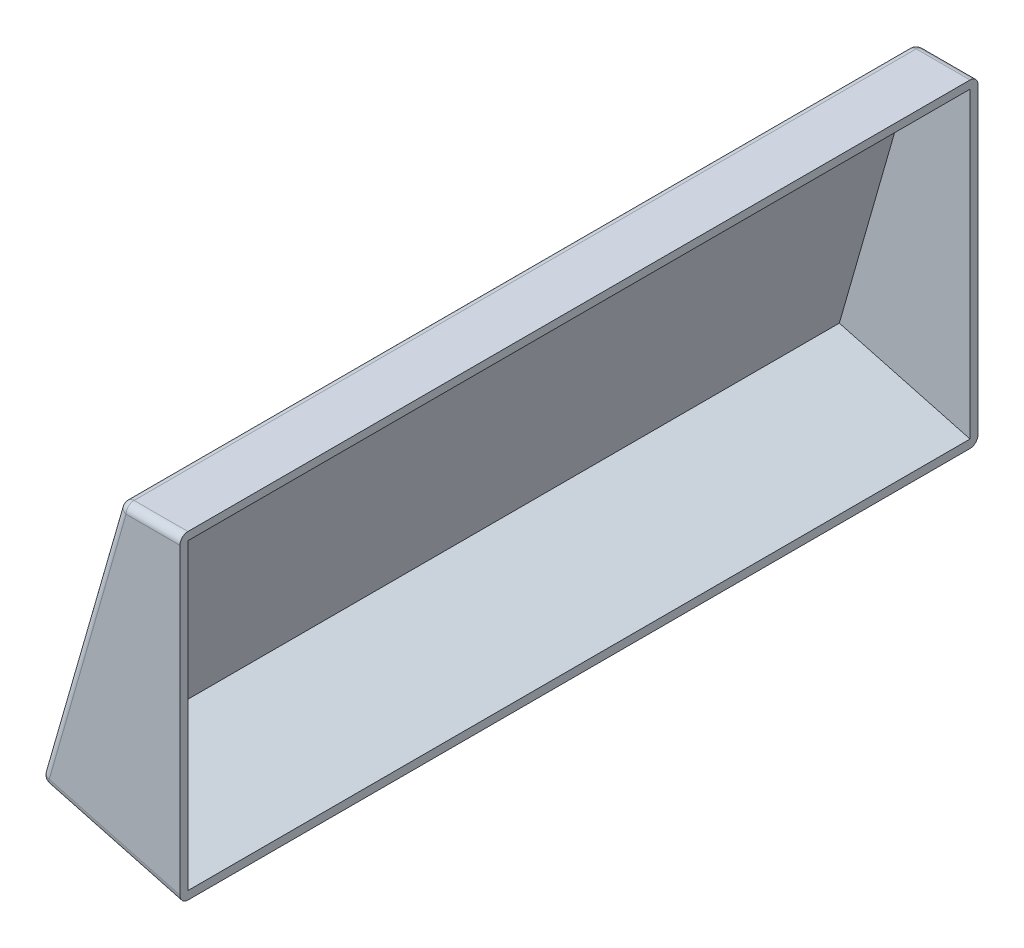
ISO-10303-21;
HEADER;
FILE_DESCRIPTION(('STEP AP214'),'2;1');
FILE_NAME('part.step','',(''),(''),'','','');
FILE_SCHEMA(('AUTOMOTIVE_DESIGN { 1 0 10303 214 1 1 1 1 }'));
ENDSEC;
DATA;
#1=APPLICATION_CONTEXT('core data for automotive mechanical design processes');
#2=APPLICATION_PROTOCOL_DEFINITION('international standard','automotive_design',2000,#1);
#3=PRODUCT_CONTEXT('',#1,'mechanical');
#4=PRODUCT('Part','Part','',(#3));
#5=PRODUCT_RELATED_PRODUCT_CATEGORY('part','',(#4));
#6=PRODUCT_DEFINITION_FORMATION('','',#4);
#7=PRODUCT_DEFINITION_CONTEXT('part definition',#1,'design');
#8=PRODUCT_DEFINITION('design','',#6,#7);
#9=PRODUCT_DEFINITION_SHAPE('','',#8);
#10=(LENGTH_UNIT() NAMED_UNIT(*) SI_UNIT(.MILLI.,.METRE.));
#11=(NAMED_UNIT(*) PLANE_ANGLE_UNIT() SI_UNIT($,.RADIAN.));
#12=(NAMED_UNIT(*) SI_UNIT($,.STERADIAN.) SOLID_ANGLE_UNIT());
#13=UNCERTAINTY_MEASURE_WITH_UNIT(LENGTH_MEASURE(1.E-05),#10,'distance_accuracy_value','');
#14=(GEOMETRIC_REPRESENTATION_CONTEXT(3) GLOBAL_UNCERTAINTY_ASSIGNED_CONTEXT((#13)) GLOBAL_UNIT_ASSIGNED_CONTEXT((#10,
#11,#12)) REPRESENTATION_CONTEXT('',''));
#15=CARTESIAN_POINT('',(0.,0.,0.));
#16=DIRECTION('',(0.,0.,1.));
#17=DIRECTION('',(1.,0.,0.));
#18=AXIS2_PLACEMENT_3D('',#15,#16,#17);
#19=CARTESIAN_POINT('',(-20.,-17.406913893828,0.));
#20=DIRECTION('',(-1.,0.,0.));
#21=DIRECTION('',(0.,0.,1.));
#22=AXIS2_PLACEMENT_3D('',#19,#20,#21);
#23=PLANE('',#22);
#24=DIRECTION('',(0.,0.,-1.));
#25=VECTOR('',#24,1.);
#26=CARTESIAN_POINT('',(-20.,-17.406913893828,0.));
#27=LINE('',#26,#25);
#28=CARTESIAN_POINT('',(-20.,-17.406913893828,-2.));
#29=VERTEX_POINT('',#28);
#30=CARTESIAN_POINT('',(-20.,-17.406913893828,-198.));
#31=VERTEX_POINT('',#30);
#32=EDGE_CURVE('E175',#29,#31,#27,.T.);
#33=ORIENTED_EDGE('',*,*,#32,.T.);
#34=CARTESIAN_POINT('',(-20.,-15.3363615330078,-198.));
#35=DIRECTION('',(-1.,0.,0.));
#36=DIRECTION('',(0.,1.,0.));
#37=AXIS2_PLACEMENT_3D('',#34,#35,#36);
#38=ELLIPSE('',#37,2.07055236082017,2.);
#39=CARTESIAN_POINT('',(-20.,-15.3363615330078,-200.));
#40=VERTEX_POINT('',#39);
#41=EDGE_CURVE('E11',#31,#40,#38,.F.);
#42=ORIENTED_EDGE('',*,*,#41,.T.);
#43=DIRECTION('',(0.,1.,0.));
#44=VECTOR('',#43,1.);
#45=CARTESIAN_POINT('',(-20.,-17.406913893828,-200.));
#46=LINE('',#45,#44);
#47=CARTESIAN_POINT('',(-20.,60.593086106172,-200.));
#48=VERTEX_POINT('',#47);
#49=EDGE_CURVE('E178',#40,#48,#46,.T.);
#50=ORIENTED_EDGE('',*,*,#49,.T.);
#51=CARTESIAN_POINT('',(-20.,60.593086106172,-198.));
#52=DIRECTION('',(-1.,0.,0.));
#53=DIRECTION('',(0.,0.,1.));
#54=AXIS2_PLACEMENT_3D('',#51,#52,#53);
#55=CIRCLE('',#54,2.);
#56=CARTESIAN_POINT('',(-20.,62.5930861061721,-198.));
#57=VERTEX_POINT('',#56);
#58=EDGE_CURVE('E42',#48,#57,#55,.F.);
#59=ORIENTED_EDGE('',*,*,#58,.T.);
#60=DIRECTION('',(0.,0.,-1.));
#61=VECTOR('',#60,1.);
#62=CARTESIAN_POINT('',(-20.,62.593086106172,0.));
#63=LINE('',#62,#61);
#64=CARTESIAN_POINT('',(-20.,62.593086106172,-2.));
#65=VERTEX_POINT('',#64);
#66=EDGE_CURVE('E184',#65,#57,#63,.T.);
#67=ORIENTED_EDGE('',*,*,#66,.F.);
#68=CARTESIAN_POINT('',(-20.,60.593086106172,-2.));
#69=DIRECTION('',(-1.,0.,0.));
#70=DIRECTION('',(0.,0.,1.));
#71=AXIS2_PLACEMENT_3D('',#68,#69,#70);
#72=CIRCLE('',#71,2.);
#73=CARTESIAN_POINT('',(-20.,60.593086106172,0.));
#74=VERTEX_POINT('',#73);
#75=EDGE_CURVE('E220',#65,#74,#72,.F.);
#76=ORIENTED_EDGE('',*,*,#75,.T.);
#77=DIRECTION('',(0.,1.,0.));
#78=VECTOR('',#77,1.);
#79=CARTESIAN_POINT('',(-20.,-17.406913893828,0.));
#80=LINE('',#79,#78);
#81=CARTESIAN_POINT('',(-20.,-15.3363615330079,0.));
#82=VERTEX_POINT('',#81);
#83=EDGE_CURVE('E179',#82,#74,#80,.T.);
#84=ORIENTED_EDGE('',*,*,#83,.F.);
#85=CARTESIAN_POINT('',(-20.,-15.3363615330079,-2.));
#86=DIRECTION('',(-1.,0.,0.));
#87=DIRECTION('',(0.,-1.,0.));
#88=AXIS2_PLACEMENT_3D('',#85,#86,#87);
#89=ELLIPSE('',#88,2.07055236082017,2.);
#90=EDGE_CURVE('E222',#82,#29,#89,.F.);
#91=ORIENTED_EDGE('',*,*,#90,.T.);
#92=EDGE_LOOP('',(#33,#42,#50,#59,#67,#76,#84,#91));
#93=FACE_BOUND('',#92,.T.);
#94=DIRECTION('',(0.,0.,-1.));
#95=VECTOR('',#94,1.);
#96=CARTESIAN_POINT('',(-20.,-15.3363615330079,0.));
#97=LINE('',#96,#95);
#98=CARTESIAN_POINT('',(-20.,-15.3363615330079,-2.));
#99=VERTEX_POINT('',#98);
#100=CARTESIAN_POINT('',(-20.,-15.3363615330078,-198.));
#101=VERTEX_POINT('',#100);
#102=EDGE_CURVE('E168',#99,#101,#97,.T.);
#103=ORIENTED_EDGE('',*,*,#102,.F.);
#104=DIRECTION('',(0.,1.,0.));
#105=VECTOR('',#104,1.);
#106=CARTESIAN_POINT('',(-20.,0.,-2.));
#107=LINE('',#106,#105);
#108=CARTESIAN_POINT('',(-20.,60.593086106172,-2.));
#109=VERTEX_POINT('',#108);
#110=EDGE_CURVE('E166',#99,#109,#107,.T.);
#111=ORIENTED_EDGE('',*,*,#110,.T.);
#112=DIRECTION('',(0.,0.,-1.));
#113=VECTOR('',#112,1.);
#114=CARTESIAN_POINT('',(-20.,60.593086106172,0.));
#115=LINE('',#114,#113);
#116=CARTESIAN_POINT('',(-20.,60.593086106172,-198.));
#117=VERTEX_POINT('',#116);
#118=EDGE_CURVE('E50',#109,#117,#115,.T.);
#119=ORIENTED_EDGE('',*,*,#118,.T.);
#120=DIRECTION('',(0.,1.,0.));
#121=VECTOR('',#120,1.);
#122=CARTESIAN_POINT('',(-20.,0.,-198.));
#123=LINE('',#122,#121);
#124=EDGE_CURVE('E171',#101,#117,#123,.T.);
#125=ORIENTED_EDGE('',*,*,#124,.F.);
#126=EDGE_LOOP('',(#103,#111,#119,#125));
#127=FACE_BOUND('',#126,.T.);
#128=ADVANCED_FACE('F33',(#93,#127),#23,.F.);
#129=CARTESIAN_POINT('',(0.,0.,0.));
#130=DIRECTION('',(0.,0.,-1.));
#131=DIRECTION('',(-1.,0.,0.));
#132=AXIS2_PLACEMENT_3D('',#129,#130,#131);
#133=PLANE('',#132);
#134=DIRECTION('',(-0.275637355817006,-0.961261695938317,0.));
#135=VECTOR('',#134,1.);
#136=CARTESIAN_POINT('',(-47.0029593585952,13.4778817130864,0.));
#137=LINE('',#136,#135);
#138=CARTESIAN_POINT('',(-33.4928918997944,60.593086106172,0.));
#139=VERTEX_POINT('',#138);
#140=CARTESIAN_POINT('',(-52.7490932041394,-6.56126845610699,0.));
#141=VERTEX_POINT('',#140);
#142=EDGE_CURVE('E205',#139,#141,#137,.T.);
#143=ORIENTED_EDGE('',*,*,#142,.T.);
#144=DIRECTION('',(0.965925826289067,-0.258819045102525,0.));
#145=VECTOR('',#144,1.);
#146=CARTESIAN_POINT('',(-5.17383634540768,-19.3090201111076,0.));
#147=LINE('',#146,#145);
#148=EDGE_CURVE('E207',#141,#82,#147,.T.);
#149=ORIENTED_EDGE('',*,*,#148,.T.);
#150=ORIENTED_EDGE('',*,*,#83,.T.);
#151=DIRECTION('',(-1.,0.,0.));
#152=VECTOR('',#151,1.);
#153=CARTESIAN_POINT('',(0.,60.593086106172,0.));
#154=LINE('',#153,#152);
#155=EDGE_CURVE('E203',#74,#139,#154,.T.);
#156=ORIENTED_EDGE('',*,*,#155,.T.);
#157=EDGE_LOOP('',(#143,#149,#150,#156));
#158=FACE_BOUND('',#157,.T.);
#159=ADVANCED_FACE('F315',(#158),#133,.F.);
#160=CARTESIAN_POINT('',(0.,0.,-200.));
#161=DIRECTION('',(0.,0.,-1.));
#162=DIRECTION('',(-1.,0.,0.));
#163=AXIS2_PLACEMENT_3D('',#160,#161,#162);
#164=PLANE('',#163);
#165=ORIENTED_EDGE('',*,*,#49,.F.);
#166=DIRECTION('',(0.965925826289067,-0.258819045102525,0.));
#167=VECTOR('',#166,1.);
#168=CARTESIAN_POINT('',(-54.7149597279284,-6.03451610863027,-200.));
#169=LINE('',#168,#167);
#170=CARTESIAN_POINT('',(-52.7490932041394,-6.5612684561069,-200.));
#171=VERTEX_POINT('',#170);
#172=EDGE_CURVE('E58',#40,#171,#169,.F.);
#173=ORIENTED_EDGE('',*,*,#172,.T.);
#174=DIRECTION('',(-0.275637355817006,-0.961261695938317,0.));
#175=VECTOR('',#174,1.);
#176=CARTESIAN_POINT('',(-33.0774766081234,62.041811394538,-200.));
#177=LINE('',#176,#175);
#178=CARTESIAN_POINT('',(-33.4928918997944,60.593086106172,-200.));
#179=VERTEX_POINT('',#178);
#180=EDGE_CURVE('E217',#171,#179,#177,.F.);
#181=ORIENTED_EDGE('',*,*,#180,.T.);
#182=DIRECTION('',(-1.,0.,0.));
#183=VECTOR('',#182,1.);
#184=CARTESIAN_POINT('',(-20.,60.593086106172,-200.));
#185=LINE('',#184,#183);
#186=EDGE_CURVE('E215',#179,#48,#185,.F.);
#187=ORIENTED_EDGE('',*,*,#186,.T.);
#188=EDGE_LOOP('',(#165,#173,#181,#187));
#189=FACE_BOUND('',#188,.T.);
#190=ADVANCED_FACE('F289',(#189),#164,.T.);
#191=CARTESIAN_POINT('',(-55.2325978181334,-7.96636776120849,0.));
#192=DIRECTION('',(0.258819045102525,0.965925826289067,0.));
#193=DIRECTION('',(-0.965925826289067,0.258819045102525,0.));
#194=AXIS2_PLACEMENT_3D('',#191,#192,#193);
#195=PLANE('',#194);
#196=DIRECTION('',(0.,0.,-1.));
#197=VECTOR('',#196,1.);
#198=CARTESIAN_POINT('',(-53.2667312943445,-8.49312010868512,0.));
#199=LINE('',#198,#197);
#200=CARTESIAN_POINT('',(-53.2667312943445,-8.49312010868512,-2.));
#201=VERTEX_POINT('',#200);
#202=CARTESIAN_POINT('',(-53.2667312943445,-8.49312010868504,-198.));
#203=VERTEX_POINT('',#202);
#204=EDGE_CURVE('E211',#201,#203,#199,.T.);
#205=ORIENTED_EDGE('',*,*,#204,.T.);
#206=DIRECTION('',(0.965925826289067,-0.258819045102525,0.));
#207=VECTOR('',#206,1.);
#208=CARTESIAN_POINT('',(-20.,-17.406913893828,-198.));
#209=LINE('',#208,#207);
#210=EDGE_CURVE('E213',#203,#31,#209,.T.);
#211=ORIENTED_EDGE('',*,*,#210,.T.);
#212=ORIENTED_EDGE('',*,*,#32,.F.);
#213=DIRECTION('',(0.965925826289067,-0.258819045102525,0.));
#214=VECTOR('',#213,1.);
#215=CARTESIAN_POINT('',(-55.2325978181334,-7.96636776120849,-2.));
#216=LINE('',#215,#214);
#217=EDGE_CURVE('E209',#29,#201,#216,.F.);
#218=ORIENTED_EDGE('',*,*,#217,.T.);
#219=EDGE_LOOP('',(#205,#211,#212,#218));
#220=FACE_BOUND('',#219,.T.);
#221=ADVANCED_FACE('F280',(#220),#195,.F.);
#222=CARTESIAN_POINT('',(-20.,62.593086106172,0.));
#223=DIRECTION('',(0.,-1.,0.));
#224=DIRECTION('',(0.,0.,-1.));
#225=AXIS2_PLACEMENT_3D('',#222,#223,#224);
#226=PLANE('',#225);
#227=ORIENTED_EDGE('',*,*,#66,.T.);
#228=DIRECTION('',(-1.,0.,0.));
#229=VECTOR('',#228,1.);
#230=CARTESIAN_POINT('',(-35.,62.5930861061721,-198.));
#231=LINE('',#230,#229);
#232=CARTESIAN_POINT('',(-33.4928918997944,62.5930861061721,-198.));
#233=VERTEX_POINT('',#232);
#234=EDGE_CURVE('E201',#57,#233,#231,.T.);
#235=ORIENTED_EDGE('',*,*,#234,.T.);
#236=DIRECTION('',(0.,0.,-1.));
#237=VECTOR('',#236,1.);
#238=CARTESIAN_POINT('',(-33.4928918997944,62.593086106172,0.));
#239=LINE('',#238,#237);
#240=CARTESIAN_POINT('',(-33.4928918997944,62.593086106172,-2.));
#241=VERTEX_POINT('',#240);
#242=EDGE_CURVE('E198',#233,#241,#239,.F.);
#243=ORIENTED_EDGE('',*,*,#242,.T.);
#244=DIRECTION('',(-1.,0.,0.));
#245=VECTOR('',#244,1.);
#246=CARTESIAN_POINT('',(-20.,62.593086106172,-2.));
#247=LINE('',#246,#245);
#248=EDGE_CURVE('E196',#241,#65,#247,.F.);
#249=ORIENTED_EDGE('',*,*,#248,.T.);
#250=EDGE_LOOP('',(#227,#235,#243,#249));
#251=FACE_BOUND('',#250,.T.);
#252=ADVANCED_FACE('F306',(#251),#226,.F.);
#253=CARTESIAN_POINT('',(-35.,62.593086106172,0.));
#254=DIRECTION('',(0.961261695938317,-0.275637355817007,0.));
#255=DIRECTION('',(0.275637355817006,0.961261695938317,0.));
#256=AXIS2_PLACEMENT_3D('',#253,#254,#255);
#257=PLANE('',#256);
#258=DIRECTION('',(-0.275637355817006,-0.961261695938317,0.));
#259=VECTOR('',#258,1.);
#260=CARTESIAN_POINT('',(-35.,62.593086106172,-2.));
#261=LINE('',#260,#259);
#262=CARTESIAN_POINT('',(-54.6716165960161,-6.00999374447297,-2.));
#263=VERTEX_POINT('',#262);
#264=CARTESIAN_POINT('',(-35.4154152916711,61.144360817806,-2.));
#265=VERTEX_POINT('',#264);
#266=EDGE_CURVE('E191',#263,#265,#261,.F.);
#267=ORIENTED_EDGE('',*,*,#266,.T.);
#268=DIRECTION('',(0.,0.,-1.));
#269=VECTOR('',#268,1.);
#270=CARTESIAN_POINT('',(-35.4154152916711,61.144360817806,0.));
#271=LINE('',#270,#269);
#272=CARTESIAN_POINT('',(-35.4154152916711,61.1443608178061,-198.));
#273=VERTEX_POINT('',#272);
#274=EDGE_CURVE('E193',#265,#273,#271,.T.);
#275=ORIENTED_EDGE('',*,*,#274,.T.);
#276=DIRECTION('',(-0.275637355817006,-0.961261695938317,0.));
#277=VECTOR('',#276,1.);
#278=CARTESIAN_POINT('',(-55.2325978181334,-7.9663677612084,-198.));
#279=LINE('',#278,#277);
#280=CARTESIAN_POINT('',(-54.6716165960161,-6.00999374447289,-198.));
#281=VERTEX_POINT('',#280);
#282=EDGE_CURVE('E187',#273,#281,#279,.T.);
#283=ORIENTED_EDGE('',*,*,#282,.T.);
#284=DIRECTION('',(0.,0.,-1.));
#285=VECTOR('',#284,1.);
#286=CARTESIAN_POINT('',(-54.6716165960161,-6.00999374447299,0.));
#287=LINE('',#286,#285);
#288=EDGE_CURVE('E189',#281,#263,#287,.F.);
#289=ORIENTED_EDGE('',*,*,#288,.T.);
#290=EDGE_LOOP('',(#267,#275,#283,#289));
#291=FACE_BOUND('',#290,.T.);
#292=ADVANCED_FACE('F270',(#291),#257,.F.);
#293=CARTESIAN_POINT('',(-5.17383634540768,-19.3090201111076,-2.));
#294=DIRECTION('',(0.965925826289067,-0.258819045102525,0.));
#295=DIRECTION('',(0.258819045102525,0.965925826289067,0.));
#296=AXIS2_PLACEMENT_3D('',#293,#294,#295);
#297=CYLINDRICAL_SURFACE('',#296,2.);
#298=ORIENTED_EDGE('',*,*,#90,.F.);
#299=ORIENTED_EDGE('',*,*,#148,.F.);
#300=CARTESIAN_POINT('',(-52.7490932041394,-6.56126845610698,-2.));
#301=DIRECTION('',(-0.965925826289067,0.258819045102526,0.));
#302=DIRECTION('',(-0.258819045102526,-0.965925826289067,0.));
#303=AXIS2_PLACEMENT_3D('',#300,#301,#302);
#304=CIRCLE('',#303,2.);
#305=EDGE_CURVE('E37',#201,#141,#304,.T.);
#306=ORIENTED_EDGE('',*,*,#305,.F.);
#307=ORIENTED_EDGE('',*,*,#217,.F.);
#308=EDGE_LOOP('',(#298,#299,#306,#307));
#309=FACE_BOUND('',#308,.T.);
#310=ADVANCED_FACE('F35',(#309),#297,.T.);
#311=CARTESIAN_POINT('',(-52.7490932041394,-6.56126845610699,0.));
#312=DIRECTION('',(0.,0.,-1.));
#313=DIRECTION('',(0.,1.,0.));
#314=AXIS2_PLACEMENT_3D('',#311,#312,#313);
#315=CYLINDRICAL_SURFACE('',#314,2.);
#316=CARTESIAN_POINT('',(-52.7490932041394,-6.5612684561069,-198.));
#317=DIRECTION('',(0.,0.,-1.));
#318=DIRECTION('',(-1.,0.,0.));
#319=AXIS2_PLACEMENT_3D('',#316,#317,#318);
#320=CIRCLE('',#319,2.);
#321=EDGE_CURVE('E249',#203,#281,#320,.T.);
#322=ORIENTED_EDGE('',*,*,#321,.F.);
#323=ORIENTED_EDGE('',*,*,#204,.F.);
#324=CARTESIAN_POINT('',(-52.7490932041394,-6.56126845610699,-2.));
#325=DIRECTION('',(0.,0.,1.));
#326=DIRECTION('',(0.,-1.,0.));
#327=AXIS2_PLACEMENT_3D('',#324,#325,#326);
#328=CIRCLE('',#327,2.);
#329=EDGE_CURVE('E251',#263,#201,#328,.T.);
#330=ORIENTED_EDGE('',*,*,#329,.F.);
#331=ORIENTED_EDGE('',*,*,#288,.F.);
#332=EDGE_LOOP('',(#322,#323,#330,#331));
#333=FACE_BOUND('',#332,.T.);
#334=ADVANCED_FACE('F277',(#333),#315,.T.);
#335=CARTESIAN_POINT('',(-54.7149597279283,-6.03451610863027,-198.));
#336=DIRECTION('',(-0.965925826289067,0.258819045102525,0.));
#337=DIRECTION('',(-0.258819045102525,-0.965925826289067,0.));
#338=AXIS2_PLACEMENT_3D('',#335,#336,#337);
#339=CYLINDRICAL_SURFACE('',#338,2.);
#340=ORIENTED_EDGE('',*,*,#41,.F.);
#341=ORIENTED_EDGE('',*,*,#210,.F.);
#342=CARTESIAN_POINT('',(-52.7490932041394,-6.5612684561069,-198.));
#343=DIRECTION('',(-0.965925826289067,0.258819045102526,0.));
#344=DIRECTION('',(-0.258819045102526,-0.965925826289067,0.));
#345=AXIS2_PLACEMENT_3D('',#342,#343,#344);
#346=CIRCLE('',#345,2.);
#347=EDGE_CURVE('E246',#171,#203,#346,.T.);
#348=ORIENTED_EDGE('',*,*,#347,.F.);
#349=ORIENTED_EDGE('',*,*,#172,.F.);
#350=EDGE_LOOP('',(#340,#341,#348,#349));
#351=FACE_BOUND('',#350,.T.);
#352=ADVANCED_FACE('F284',(#351),#339,.T.);
#353=CARTESIAN_POINT('',(-52.7490932041394,-6.56126845610698,-2.));
#354=DIRECTION('',(0.,0.,1.));
#355=DIRECTION('',(1.,0.,0.));
#356=AXIS2_PLACEMENT_3D('',#353,#354,#355);
#357=SPHERICAL_SURFACE('',#356,2.);
#358=ORIENTED_EDGE('',*,*,#329,.T.);
#359=ORIENTED_EDGE('',*,*,#305,.T.);
#360=CARTESIAN_POINT('',(-52.7490932041394,-6.56126845610699,-2.));
#361=DIRECTION('',(-0.275637355817008,-0.961261695938316,0.));
#362=DIRECTION('',(0.961261695938316,-0.275637355817008,0.));
#363=AXIS2_PLACEMENT_3D('',#360,#361,#362);
#364=CIRCLE('',#363,2.);
#365=EDGE_CURVE('E243',#263,#141,#364,.F.);
#366=ORIENTED_EDGE('',*,*,#365,.F.);
#367=EDGE_LOOP('',(#358,#359,#366));
#368=FACE_BOUND('',#367,.T.);
#369=ADVANCED_FACE('F258',(#368),#357,.T.);
#370=CARTESIAN_POINT('',(-52.7490932041394,-6.5612684561069,-198.));
#371=DIRECTION('',(0.,0.,1.));
#372=DIRECTION('',(1.,0.,0.));
#373=AXIS2_PLACEMENT_3D('',#370,#371,#372);
#374=SPHERICAL_SURFACE('',#373,2.);
#375=ORIENTED_EDGE('',*,*,#347,.T.);
#376=ORIENTED_EDGE('',*,*,#321,.T.);
#377=CARTESIAN_POINT('',(-52.7490932041394,-6.5612684561069,-198.));
#378=DIRECTION('',(-0.275637355817007,-0.961261695938317,0.));
#379=DIRECTION('',(0.961261695938317,-0.275637355817007,0.));
#380=AXIS2_PLACEMENT_3D('',#377,#378,#379);
#381=CIRCLE('',#380,2.);
#382=EDGE_CURVE('E240',#171,#281,#381,.F.);
#383=ORIENTED_EDGE('',*,*,#382,.F.);
#384=EDGE_LOOP('',(#375,#376,#383));
#385=FACE_BOUND('',#384,.T.);
#386=ADVANCED_FACE('F352',(#385),#374,.T.);
#387=CARTESIAN_POINT('',(0.,60.593086106172,-2.));
#388=DIRECTION('',(-1.,0.,0.));
#389=DIRECTION('',(0.,0.,1.));
#390=AXIS2_PLACEMENT_3D('',#387,#388,#389);
#391=CYLINDRICAL_SURFACE('',#390,2.);
#392=ORIENTED_EDGE('',*,*,#75,.F.);
#393=ORIENTED_EDGE('',*,*,#248,.F.);
#394=CARTESIAN_POINT('',(-33.4928918997944,60.593086106172,-2.));
#395=DIRECTION('',(-1.,0.,0.));
#396=DIRECTION('',(0.,0.,1.));
#397=AXIS2_PLACEMENT_3D('',#394,#395,#396);
#398=CIRCLE('',#397,2.);
#399=EDGE_CURVE('E237',#139,#241,#398,.T.);
#400=ORIENTED_EDGE('',*,*,#399,.F.);
#401=ORIENTED_EDGE('',*,*,#155,.F.);
#402=EDGE_LOOP('',(#392,#393,#400,#401));
#403=FACE_BOUND('',#402,.T.);
#404=ADVANCED_FACE('F313',(#403),#391,.T.);
#405=CARTESIAN_POINT('',(-47.0029593585952,13.4778817130864,-2.));
#406=DIRECTION('',(-0.275637355817006,-0.961261695938317,0.));
#407=DIRECTION('',(0.961261695938317,-0.275637355817007,0.));
#408=AXIS2_PLACEMENT_3D('',#405,#406,#407);
#409=CYLINDRICAL_SURFACE('',#408,2.);
#410=ORIENTED_EDGE('',*,*,#365,.T.);
#411=ORIENTED_EDGE('',*,*,#142,.F.);
#412=CARTESIAN_POINT('',(-33.4928918997944,60.593086106172,-2.));
#413=DIRECTION('',(0.275637355817007,0.961261695938317,0.));
#414=DIRECTION('',(-0.961261695938317,0.275637355817007,0.));
#415=AXIS2_PLACEMENT_3D('',#412,#413,#414);
#416=CIRCLE('',#415,2.);
#417=EDGE_CURVE('E234',#265,#139,#416,.T.);
#418=ORIENTED_EDGE('',*,*,#417,.F.);
#419=ORIENTED_EDGE('',*,*,#266,.F.);
#420=EDGE_LOOP('',(#410,#411,#418,#419));
#421=FACE_BOUND('',#420,.T.);
#422=ADVANCED_FACE('F265',(#421),#409,.T.);
#423=CARTESIAN_POINT('',(-33.0774766081234,62.041811394538,-198.));
#424=DIRECTION('',(0.275637355817006,0.961261695938317,0.));
#425=DIRECTION('',(-0.961261695938317,0.275637355817007,0.));
#426=AXIS2_PLACEMENT_3D('',#423,#424,#425);
#427=CYLINDRICAL_SURFACE('',#426,2.);
#428=ORIENTED_EDGE('',*,*,#382,.T.);
#429=ORIENTED_EDGE('',*,*,#282,.F.);
#430=CARTESIAN_POINT('',(-33.4928918997944,60.593086106172,-198.));
#431=DIRECTION('',(0.275637355817007,0.961261695938317,0.));
#432=DIRECTION('',(-0.961261695938317,0.275637355817007,0.));
#433=AXIS2_PLACEMENT_3D('',#430,#431,#432);
#434=CIRCLE('',#433,2.);
#435=EDGE_CURVE('E231',#179,#273,#434,.T.);
#436=ORIENTED_EDGE('',*,*,#435,.F.);
#437=ORIENTED_EDGE('',*,*,#180,.F.);
#438=EDGE_LOOP('',(#428,#429,#436,#437));
#439=FACE_BOUND('',#438,.T.);
#440=ADVANCED_FACE('F299',(#439),#427,.T.);
#441=CARTESIAN_POINT('',(-20.,60.593086106172,-198.));
#442=DIRECTION('',(1.,0.,0.));
#443=DIRECTION('',(0.,0.,-1.));
#444=AXIS2_PLACEMENT_3D('',#441,#442,#443);
#445=CYLINDRICAL_SURFACE('',#444,2.);
#446=ORIENTED_EDGE('',*,*,#58,.F.);
#447=ORIENTED_EDGE('',*,*,#186,.F.);
#448=CARTESIAN_POINT('',(-33.4928918997944,60.593086106172,-198.));
#449=DIRECTION('',(-1.,0.,0.));
#450=DIRECTION('',(0.,0.,1.));
#451=AXIS2_PLACEMENT_3D('',#448,#449,#450);
#452=CIRCLE('',#451,2.);
#453=EDGE_CURVE('E228',#233,#179,#452,.T.);
#454=ORIENTED_EDGE('',*,*,#453,.F.);
#455=ORIENTED_EDGE('',*,*,#234,.F.);
#456=EDGE_LOOP('',(#446,#447,#454,#455));
#457=FACE_BOUND('',#456,.T.);
#458=ADVANCED_FACE('F295',(#457),#445,.T.);
#459=CARTESIAN_POINT('',(-33.4928918997944,60.593086106172,-2.));
#460=DIRECTION('',(0.,0.,1.));
#461=DIRECTION('',(1.,0.,0.));
#462=AXIS2_PLACEMENT_3D('',#459,#460,#461);
#463=SPHERICAL_SURFACE('',#462,2.);
#464=ORIENTED_EDGE('',*,*,#417,.T.);
#465=ORIENTED_EDGE('',*,*,#399,.T.);
#466=CARTESIAN_POINT('',(-33.4928918997944,60.593086106172,-2.));
#467=DIRECTION('',(0.,0.,1.));
#468=DIRECTION('',(0.,-1.,0.));
#469=AXIS2_PLACEMENT_3D('',#466,#467,#468);
#470=CIRCLE('',#469,2.);
#471=EDGE_CURVE('E226',#265,#241,#470,.F.);
#472=ORIENTED_EDGE('',*,*,#471,.F.);
#473=EDGE_LOOP('',(#464,#465,#472));
#474=FACE_BOUND('',#473,.T.);
#475=ADVANCED_FACE('F340',(#474),#463,.T.);
#476=CARTESIAN_POINT('',(-33.4928918997944,60.593086106172,-198.));
#477=DIRECTION('',(0.,0.,1.));
#478=DIRECTION('',(1.,0.,0.));
#479=AXIS2_PLACEMENT_3D('',#476,#477,#478);
#480=SPHERICAL_SURFACE('',#479,2.);
#481=ORIENTED_EDGE('',*,*,#453,.T.);
#482=ORIENTED_EDGE('',*,*,#435,.T.);
#483=CARTESIAN_POINT('',(-33.4928918997944,60.593086106172,-198.));
#484=DIRECTION('',(0.,0.,-1.));
#485=DIRECTION('',(-1.,0.,0.));
#486=AXIS2_PLACEMENT_3D('',#483,#484,#485);
#487=CIRCLE('',#486,2.);
#488=EDGE_CURVE('E164',#233,#273,#487,.F.);
#489=ORIENTED_EDGE('',*,*,#488,.F.);
#490=EDGE_LOOP('',(#481,#482,#489));
#491=FACE_BOUND('',#490,.T.);
#492=ADVANCED_FACE('F302',(#491),#480,.T.);
#493=CARTESIAN_POINT('',(-33.4928918997944,60.593086106172,0.));
#494=DIRECTION('',(0.,0.,-1.));
#495=DIRECTION('',(0.,1.,0.));
#496=AXIS2_PLACEMENT_3D('',#493,#494,#495);
#497=CYLINDRICAL_SURFACE('',#496,2.);
#498=ORIENTED_EDGE('',*,*,#471,.T.);
#499=ORIENTED_EDGE('',*,*,#242,.F.);
#500=ORIENTED_EDGE('',*,*,#488,.T.);
#501=ORIENTED_EDGE('',*,*,#274,.F.);
#502=EDGE_LOOP('',(#498,#499,#500,#501));
#503=FACE_BOUND('',#502,.T.);
#504=ADVANCED_FACE('F304',(#503),#497,.T.);
#505=CARTESIAN_POINT('',(0.,0.,-2.));
#506=DIRECTION('',(0.,0.,-1.));
#507=DIRECTION('',(-1.,0.,0.));
#508=AXIS2_PLACEMENT_3D('',#505,#506,#507);
#509=PLANE('',#508);
#510=DIRECTION('',(-0.275637355817006,-0.961261695938317,0.));
#511=VECTOR('',#510,1.);
#512=CARTESIAN_POINT('',(-47.0029593585952,13.4778817130864,-2.));
#513=LINE('',#512,#511);
#514=CARTESIAN_POINT('',(-33.4928918997944,60.593086106172,-2.));
#515=VERTEX_POINT('',#514);
#516=CARTESIAN_POINT('',(-52.7490932041394,-6.56126845610698,-2.));
#517=VERTEX_POINT('',#516);
#518=EDGE_CURVE('E137',#515,#517,#513,.T.);
#519=ORIENTED_EDGE('',*,*,#518,.F.);
#520=DIRECTION('',(1.,0.,0.));
#521=VECTOR('',#520,1.);
#522=CARTESIAN_POINT('',(-20.,60.593086106172,-2.));
#523=LINE('',#522,#521);
#524=EDGE_CURVE('E141',#515,#109,#523,.T.);
#525=ORIENTED_EDGE('',*,*,#524,.T.);
#526=ORIENTED_EDGE('',*,*,#110,.F.);
#527=DIRECTION('',(0.965925826289067,-0.258819045102525,0.));
#528=VECTOR('',#527,1.);
#529=CARTESIAN_POINT('',(-5.17383634540768,-19.3090201111076,-2.));
#530=LINE('',#529,#528);
#531=EDGE_CURVE('E143',#517,#99,#530,.T.);
#532=ORIENTED_EDGE('',*,*,#531,.F.);
#533=EDGE_LOOP('',(#519,#525,#526,#532));
#534=FACE_BOUND('',#533,.T.);
#535=ADVANCED_FACE('F139',(#534),#509,.T.);
#536=CARTESIAN_POINT('',(0.,0.,-198.));
#537=DIRECTION('',(0.,0.,-1.));
#538=DIRECTION('',(-1.,0.,0.));
#539=AXIS2_PLACEMENT_3D('',#536,#537,#538);
#540=PLANE('',#539);
#541=ORIENTED_EDGE('',*,*,#124,.T.);
#542=DIRECTION('',(1.,0.,0.));
#543=VECTOR('',#542,1.);
#544=CARTESIAN_POINT('',(-20.,60.593086106172,-198.));
#545=LINE('',#544,#543);
#546=CARTESIAN_POINT('',(-33.4928918997944,60.593086106172,-198.));
#547=VERTEX_POINT('',#546);
#548=EDGE_CURVE('E162',#547,#117,#545,.T.);
#549=ORIENTED_EDGE('',*,*,#548,.F.);
#550=DIRECTION('',(-0.275637355817006,-0.961261695938317,0.));
#551=VECTOR('',#550,1.);
#552=CARTESIAN_POINT('',(-47.0029593585952,13.4778817130864,-198.));
#553=LINE('',#552,#551);
#554=CARTESIAN_POINT('',(-52.7490932041394,-6.5612684561069,-198.));
#555=VERTEX_POINT('',#554);
#556=EDGE_CURVE('E152',#547,#555,#553,.T.);
#557=ORIENTED_EDGE('',*,*,#556,.T.);
#558=DIRECTION('',(0.965925826289067,-0.258819045102525,0.));
#559=VECTOR('',#558,1.);
#560=CARTESIAN_POINT('',(-5.17383634540767,-19.3090201111075,-198.));
#561=LINE('',#560,#559);
#562=EDGE_CURVE('E161',#555,#101,#561,.T.);
#563=ORIENTED_EDGE('',*,*,#562,.T.);
#564=EDGE_LOOP('',(#541,#549,#557,#563));
#565=FACE_BOUND('',#564,.T.);
#566=ADVANCED_FACE('F405',(#565),#540,.F.);
#567=CARTESIAN_POINT('',(-54.7149597279284,-6.03451610863035,0.));
#568=DIRECTION('',(0.258819045102525,0.965925826289067,0.));
#569=DIRECTION('',(-0.965925826289067,0.258819045102525,0.));
#570=AXIS2_PLACEMENT_3D('',#567,#568,#569);
#571=PLANE('',#570);
#572=DIRECTION('',(0.,0.,-1.));
#573=VECTOR('',#572,1.);
#574=CARTESIAN_POINT('',(-52.7490932041394,-6.56126845610699,0.));
#575=LINE('',#574,#573);
#576=EDGE_CURVE('E159',#517,#555,#575,.T.);
#577=ORIENTED_EDGE('',*,*,#576,.F.);
#578=ORIENTED_EDGE('',*,*,#531,.T.);
#579=ORIENTED_EDGE('',*,*,#102,.T.);
#580=ORIENTED_EDGE('',*,*,#562,.F.);
#581=EDGE_LOOP('',(#577,#578,#579,#580));
#582=FACE_BOUND('',#581,.T.);
#583=ADVANCED_FACE('F412',(#582),#571,.T.);
#584=CARTESIAN_POINT('',(-20.,60.593086106172,0.));
#585=DIRECTION('',(0.,-1.,0.));
#586=DIRECTION('',(0.,0.,-1.));
#587=AXIS2_PLACEMENT_3D('',#584,#585,#586);
#588=PLANE('',#587);
#589=ORIENTED_EDGE('',*,*,#118,.F.);
#590=ORIENTED_EDGE('',*,*,#524,.F.);
#591=DIRECTION('',(0.,0.,1.));
#592=VECTOR('',#591,1.);
#593=CARTESIAN_POINT('',(-33.4928918997944,60.593086106172,0.));
#594=LINE('',#593,#592);
#595=EDGE_CURVE('E146',#547,#515,#594,.T.);
#596=ORIENTED_EDGE('',*,*,#595,.F.);
#597=ORIENTED_EDGE('',*,*,#548,.T.);
#598=EDGE_LOOP('',(#589,#590,#596,#597));
#599=FACE_BOUND('',#598,.T.);
#600=ADVANCED_FACE('F154',(#599),#588,.T.);
#601=CARTESIAN_POINT('',(-33.0774766081234,62.041811394538,0.));
#602=DIRECTION('',(0.961261695938317,-0.275637355817007,0.));
#603=DIRECTION('',(0.275637355817006,0.961261695938317,0.));
#604=AXIS2_PLACEMENT_3D('',#601,#602,#603);
#605=PLANE('',#604);
#606=ORIENTED_EDGE('',*,*,#518,.T.);
#607=ORIENTED_EDGE('',*,*,#576,.T.);
#608=ORIENTED_EDGE('',*,*,#556,.F.);
#609=ORIENTED_EDGE('',*,*,#595,.T.);
#610=EDGE_LOOP('',(#606,#607,#608,#609));
#611=FACE_BOUND('',#610,.T.);
#612=ADVANCED_FACE('F150',(#611),#605,.T.);
#613=CLOSED_SHELL('',(#128,#159,#190,#221,#252,#292,#310,#334,#352,#369,#386,#404,#422,#440,
#458,#475,#492,#504,#535,#566,#583,#600,#612));
#614=MANIFOLD_SOLID_BREP('B2',#613);
#615=ADVANCED_BREP_SHAPE_REPRESENTATION('',(#18,#614),#14);
#616=SHAPE_DEFINITION_REPRESENTATION(#9,#615);
ENDSEC;
END-ISO-10303-21;
